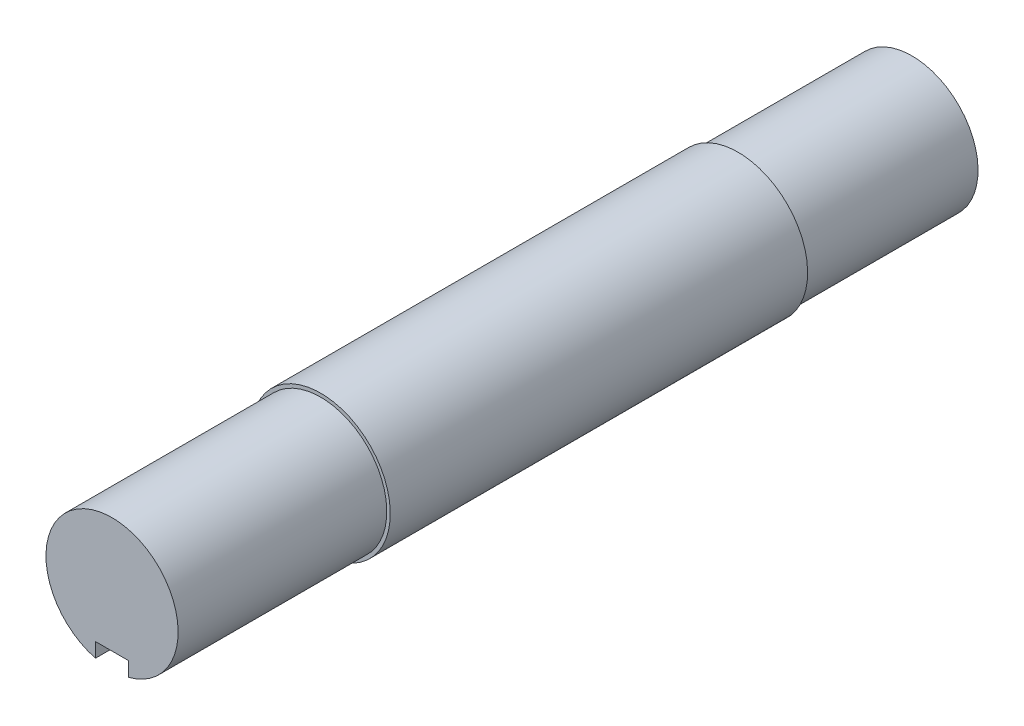
ISO-10303-21;
HEADER;
FILE_DESCRIPTION(('STEP AP214'),'2;1');
FILE_NAME('part.step','',(''),(''),'','','');
FILE_SCHEMA(('AUTOMOTIVE_DESIGN { 1 0 10303 214 1 1 1 1 }'));
ENDSEC;
DATA;
#1=APPLICATION_CONTEXT('core data for automotive mechanical design processes');
#2=APPLICATION_PROTOCOL_DEFINITION('international standard','automotive_design',2000,#1);
#3=PRODUCT_CONTEXT('',#1,'mechanical');
#4=PRODUCT('Part','Part','',(#3));
#5=PRODUCT_RELATED_PRODUCT_CATEGORY('part','',(#4));
#6=PRODUCT_DEFINITION_FORMATION('','',#4);
#7=PRODUCT_DEFINITION_CONTEXT('part definition',#1,'design');
#8=PRODUCT_DEFINITION('design','',#6,#7);
#9=PRODUCT_DEFINITION_SHAPE('','',#8);
#10=(LENGTH_UNIT() NAMED_UNIT(*) SI_UNIT(.MILLI.,.METRE.));
#11=(NAMED_UNIT(*) PLANE_ANGLE_UNIT() SI_UNIT($,.RADIAN.));
#12=(NAMED_UNIT(*) SI_UNIT($,.STERADIAN.) SOLID_ANGLE_UNIT());
#13=UNCERTAINTY_MEASURE_WITH_UNIT(LENGTH_MEASURE(1.E-05),#10,'distance_accuracy_value','');
#14=(GEOMETRIC_REPRESENTATION_CONTEXT(3) GLOBAL_UNCERTAINTY_ASSIGNED_CONTEXT((#13)) GLOBAL_UNIT_ASSIGNED_CONTEXT((#10,
#11,#12)) REPRESENTATION_CONTEXT('',''));
#15=CARTESIAN_POINT('',(0.,0.,0.));
#16=DIRECTION('',(0.,0.,1.));
#17=DIRECTION('',(1.,0.,0.));
#18=AXIS2_PLACEMENT_3D('',#15,#16,#17);
#19=CARTESIAN_POINT('',(-62.6618482291602,-361.310070053825,-562.673899999993));
#20=DIRECTION('',(0.,0.,-1.));
#21=DIRECTION('',(-1.,0.,0.));
#22=AXIS2_PLACEMENT_3D('',#19,#20,#21);
#23=CONICAL_SURFACE('',#22,3.39999999994989,1.02974425866087);
#24=CARTESIAN_POINT('',(-62.6618482291602,-361.310070053776,-560.630973895314));
#25=VERTEX_POINT('',#24);
#26=VERTEX_LOOP('',#25);
#27=FACE_BOUND('',#26,.T.);
#28=CARTESIAN_POINT('',(-62.6618482291602,-361.310070053825,-562.6739));
#29=DIRECTION('',(0.,0.,-1.));
#30=DIRECTION('',(-1.,0.,0.));
#31=AXIS2_PLACEMENT_3D('',#28,#29,#30);
#32=CIRCLE('',#31,3.4);
#33=CARTESIAN_POINT('',(-66.0618482291602,-361.310070053825,-562.6739));
#34=VERTEX_POINT('',#33);
#35=EDGE_CURVE('E174',#34,#34,#32,.T.);
#36=ORIENTED_EDGE('',*,*,#35,.T.);
#37=EDGE_LOOP('',(#36));
#38=FACE_BOUND('',#37,.T.);
#39=ADVANCED_FACE('F17',(#27,#38),#23,.F.);
#40=CARTESIAN_POINT('',(-62.6618482291602,-361.310070053825,-586.1739));
#41=DIRECTION('',(0.,0.,-1.));
#42=DIRECTION('',(-1.,0.,0.));
#43=AXIS2_PLACEMENT_3D('',#40,#41,#42);
#44=CYLINDRICAL_SURFACE('',#43,3.4);
#45=ORIENTED_EDGE('',*,*,#35,.F.);
#46=EDGE_LOOP('',(#45));
#47=FACE_BOUND('',#46,.T.);
#48=CARTESIAN_POINT('',(-62.6618482291602,-361.310070053825,-585.502730312044));
#49=DIRECTION('',(0.,0.,-1.));
#50=DIRECTION('',(1.,0.,0.));
#51=AXIS2_PLACEMENT_3D('',#48,#49,#50);
#52=CIRCLE('',#51,3.40000000001882);
#53=CARTESIAN_POINT('',(-59.2618482291414,-361.310070053825,-585.502730312044));
#54=VERTEX_POINT('',#53);
#55=EDGE_CURVE('E171',#54,#54,#52,.T.);
#56=ORIENTED_EDGE('',*,*,#55,.T.);
#57=EDGE_LOOP('',(#56));
#58=FACE_BOUND('',#57,.T.);
#59=ADVANCED_FACE('F252',(#47,#58),#44,.F.);
#60=CARTESIAN_POINT('',(-62.6618482291602,-361.310070053825,-586.173900000063));
#61=DIRECTION('',(0.,0.,-1.));
#62=DIRECTION('',(-1.,0.,0.));
#63=AXIS2_PLACEMENT_3D('',#60,#61,#62);
#64=CONICAL_SURFACE('',#63,4.56250000015333,1.04719755118561);
#65=CARTESIAN_POINT('',(-62.6618482291602,-361.310070053825,-586.173900000018));
#66=DIRECTION('',(0.,0.,-1.));
#67=DIRECTION('',(-1.,0.,0.));
#68=AXIS2_PLACEMENT_3D('',#65,#66,#67);
#69=CIRCLE('',#68,4.56250000007685);
#70=CARTESIAN_POINT('',(-67.2243482292371,-361.310070053825,-586.173900000018));
#71=VERTEX_POINT('',#70);
#72=EDGE_CURVE('E20',#71,#71,#69,.F.);
#73=ORIENTED_EDGE('',*,*,#72,.F.);
#74=EDGE_LOOP('',(#73));
#75=FACE_BOUND('',#74,.T.);
#76=ORIENTED_EDGE('',*,*,#55,.F.);
#77=EDGE_LOOP('',(#76));
#78=FACE_BOUND('',#77,.T.);
#79=ADVANCED_FACE('F249',(#75,#78),#64,.F.);
#80=CARTESIAN_POINT('',(-62.6618476114882,-361.310072168843,-586.1739));
#81=DIRECTION('',(0.,0.,-1.));
#82=DIRECTION('',(-1.,0.,0.));
#83=AXIS2_PLACEMENT_3D('',#80,#81,#82);
#84=PLANE('',#83);
#85=DIRECTION('',(1.,0.,0.));
#86=VECTOR('',#85,1.);
#87=CARTESIAN_POINT('',(-62.6618476114881,-368.428822168843,-586.1739));
#88=LINE('',#87,#86);
#89=CARTESIAN_POINT('',(-65.0430976114882,-368.428822168843,-586.1739));
#90=VERTEX_POINT('',#89);
#91=CARTESIAN_POINT('',(-60.2805976114881,-368.428822168843,-586.1739));
#92=VERTEX_POINT('',#91);
#93=EDGE_CURVE('E154',#90,#92,#88,.T.);
#94=ORIENTED_EDGE('',*,*,#93,.F.);
#95=DIRECTION('',(0.,-1.,0.));
#96=VECTOR('',#95,1.);
#97=CARTESIAN_POINT('',(-65.0430976114882,-368.428822168843,-586.1739));
#98=LINE('',#97,#96);
#99=CARTESIAN_POINT('',(-65.0430976114883,-370.506791607724,-586.1739));
#100=VERTEX_POINT('',#99);
#101=EDGE_CURVE('E148',#90,#100,#98,.T.);
#102=ORIENTED_EDGE('',*,*,#101,.T.);
#103=CARTESIAN_POINT('',(-62.6618476114882,-361.310072168843,-586.1739));
#104=DIRECTION('',(0.,0.,1.));
#105=DIRECTION('',(0.,-1.,0.));
#106=AXIS2_PLACEMENT_3D('',#103,#104,#105);
#107=CIRCLE('',#106,9.5);
#108=CARTESIAN_POINT('',(-60.280597611488,-370.506791607724,-586.1739));
#109=VERTEX_POINT('',#108);
#110=EDGE_CURVE('E387',#109,#100,#107,.T.);
#111=ORIENTED_EDGE('',*,*,#110,.F.);
#112=DIRECTION('',(0.,1.,0.));
#113=VECTOR('',#112,1.);
#114=CARTESIAN_POINT('',(-60.2805976114881,-368.428822168843,-586.1739));
#115=LINE('',#114,#113);
#116=EDGE_CURVE('E75',#109,#92,#115,.T.);
#117=ORIENTED_EDGE('',*,*,#116,.T.);
#118=EDGE_LOOP('',(#94,#102,#111,#117));
#119=FACE_BOUND('',#118,.T.);
#120=ORIENTED_EDGE('',*,*,#72,.T.);
#121=EDGE_LOOP('',(#120));
#122=FACE_BOUND('',#121,.T.);
#123=ADVANCED_FACE('F246',(#119,#122),#84,.T.);
#124=CARTESIAN_POINT('',(-60.2805976114881,-368.428822168843,-561.5739));
#125=DIRECTION('',(1.,0.,0.));
#126=DIRECTION('',(0.,1.,0.));
#127=AXIS2_PLACEMENT_3D('',#124,#125,#126);
#128=PLANE('',#127);
#129=DIRECTION('',(0.,0.,1.));
#130=VECTOR('',#129,1.);
#131=CARTESIAN_POINT('',(-60.280597611488,-370.506791607724,-506.1739));
#132=LINE('',#131,#130);
#133=CARTESIAN_POINT('',(-60.2805976114881,-370.506791607724,-561.1739));
#134=VERTEX_POINT('',#133);
#135=EDGE_CURVE('E142',#134,#109,#132,.F.);
#136=ORIENTED_EDGE('',*,*,#135,.F.);
#137=DIRECTION('',(0.,-1.,0.));
#138=VECTOR('',#137,1.);
#139=CARTESIAN_POINT('',(-60.2805976114881,-368.428822168843,-561.1739));
#140=LINE('',#139,#138);
#141=CARTESIAN_POINT('',(-60.2805976114881,-368.428822168843,-561.1739));
#142=VERTEX_POINT('',#141);
#143=EDGE_CURVE('E386',#134,#142,#140,.F.);
#144=ORIENTED_EDGE('',*,*,#143,.T.);
#145=DIRECTION('',(0.,0.,1.));
#146=VECTOR('',#145,1.);
#147=CARTESIAN_POINT('',(-60.2805976114881,-368.428822168843,-571.5739));
#148=LINE('',#147,#146);
#149=EDGE_CURVE('E149',#92,#142,#148,.T.);
#150=ORIENTED_EDGE('',*,*,#149,.F.);
#151=ORIENTED_EDGE('',*,*,#116,.F.);
#152=EDGE_LOOP('',(#136,#144,#150,#151));
#153=FACE_BOUND('',#152,.T.);
#154=ADVANCED_FACE('F242',(#153),#128,.F.);
#155=CARTESIAN_POINT('',(-62.6618476114881,-368.428822168843,-571.5739));
#156=DIRECTION('',(0.,-1.,0.));
#157=DIRECTION('',(1.,0.,0.));
#158=AXIS2_PLACEMENT_3D('',#155,#156,#157);
#159=PLANE('',#158);
#160=CARTESIAN_POINT('',(-62.6618476114881,-368.428822168843,-561.1739));
#161=DIRECTION('',(0.,-1.,0.));
#162=DIRECTION('',(1.,0.,0.));
#163=AXIS2_PLACEMENT_3D('',#160,#161,#162);
#164=CIRCLE('',#163,2.38125000000002);
#165=CARTESIAN_POINT('',(-65.0430976114882,-368.428822168843,-561.1739));
#166=VERTEX_POINT('',#165);
#167=EDGE_CURVE('E379',#142,#166,#164,.T.);
#168=ORIENTED_EDGE('',*,*,#167,.T.);
#169=DIRECTION('',(0.,0.,1.));
#170=VECTOR('',#169,1.);
#171=CARTESIAN_POINT('',(-65.0430976114882,-368.428822168843,-586.5739));
#172=LINE('',#171,#170);
#173=EDGE_CURVE('E145',#166,#90,#172,.F.);
#174=ORIENTED_EDGE('',*,*,#173,.T.);
#175=ORIENTED_EDGE('',*,*,#93,.T.);
#176=ORIENTED_EDGE('',*,*,#149,.T.);
#177=EDGE_LOOP('',(#168,#174,#175,#176));
#178=FACE_BOUND('',#177,.T.);
#179=ADVANCED_FACE('F238',(#178),#159,.T.);
#180=CARTESIAN_POINT('',(-65.0430976114882,-368.428822168843,-586.5739));
#181=DIRECTION('',(-1.,0.,0.));
#182=DIRECTION('',(0.,-1.,0.));
#183=AXIS2_PLACEMENT_3D('',#180,#181,#182);
#184=PLANE('',#183);
#185=ORIENTED_EDGE('',*,*,#101,.F.);
#186=ORIENTED_EDGE('',*,*,#173,.F.);
#187=DIRECTION('',(0.,-1.,0.));
#188=VECTOR('',#187,1.);
#189=CARTESIAN_POINT('',(-65.0430976114881,-368.428822168843,-561.1739));
#190=LINE('',#189,#188);
#191=CARTESIAN_POINT('',(-65.0430976114882,-370.506791607724,-561.1739));
#192=VERTEX_POINT('',#191);
#193=EDGE_CURVE('E108',#166,#192,#190,.T.);
#194=ORIENTED_EDGE('',*,*,#193,.T.);
#195=DIRECTION('',(0.,0.,1.));
#196=VECTOR('',#195,1.);
#197=CARTESIAN_POINT('',(-65.0430976114884,-370.506791607724,-506.1739));
#198=LINE('',#197,#196);
#199=EDGE_CURVE('E382',#100,#192,#198,.T.);
#200=ORIENTED_EDGE('',*,*,#199,.F.);
#201=EDGE_LOOP('',(#185,#186,#194,#200));
#202=FACE_BOUND('',#201,.T.);
#203=ADVANCED_FACE('F235',(#202),#184,.F.);
#204=CARTESIAN_POINT('',(-62.6618476114881,-368.428822168843,-571.5739));
#205=DIRECTION('',(0.,-1.,0.));
#206=DIRECTION('',(1.,0.,0.));
#207=AXIS2_PLACEMENT_3D('',#204,#205,#206);
#208=PLANE('',#207);
#209=DIRECTION('',(0.,0.,1.));
#210=VECTOR('',#209,1.);
#211=CARTESIAN_POINT('',(-60.2805976114881,-368.428822168843,-471.1739));
#212=LINE('',#211,#210);
#213=CARTESIAN_POINT('',(-60.2805976114881,-368.428822168843,-501.1739));
#214=VERTEX_POINT('',#213);
#215=CARTESIAN_POINT('',(-60.2805976114881,-368.428822168843,-471.1739));
#216=VERTEX_POINT('',#215);
#217=EDGE_CURVE('E164',#214,#216,#212,.T.);
#218=ORIENTED_EDGE('',*,*,#217,.T.);
#219=DIRECTION('',(1.,0.,0.));
#220=VECTOR('',#219,1.);
#221=CARTESIAN_POINT('',(-39.6618476114882,-368.428822168843,-471.1739));
#222=LINE('',#221,#220);
#223=CARTESIAN_POINT('',(-65.0430976114882,-368.428822168843,-471.1739));
#224=VERTEX_POINT('',#223);
#225=EDGE_CURVE('E84',#224,#216,#222,.T.);
#226=ORIENTED_EDGE('',*,*,#225,.F.);
#227=DIRECTION('',(0.,0.,1.));
#228=VECTOR('',#227,1.);
#229=CARTESIAN_POINT('',(-65.0430976114882,-368.428822168843,-501.1739));
#230=LINE('',#229,#228);
#231=CARTESIAN_POINT('',(-65.0430976114882,-368.428822168843,-501.1739));
#232=VERTEX_POINT('',#231);
#233=EDGE_CURVE('E140',#224,#232,#230,.F.);
#234=ORIENTED_EDGE('',*,*,#233,.T.);
#235=CARTESIAN_POINT('',(-62.6618476114881,-368.428822168843,-501.1739));
#236=DIRECTION('',(0.,-1.,0.));
#237=DIRECTION('',(1.,0.,0.));
#238=AXIS2_PLACEMENT_3D('',#235,#236,#237);
#239=CIRCLE('',#238,2.38125000000002);
#240=EDGE_CURVE('E132',#232,#214,#239,.T.);
#241=ORIENTED_EDGE('',*,*,#240,.T.);
#242=EDGE_LOOP('',(#218,#226,#234,#241));
#243=FACE_BOUND('',#242,.T.);
#244=ADVANCED_FACE('F231',(#243),#208,.T.);
#245=CARTESIAN_POINT('',(-39.6618476114882,-361.310072168843,-471.1739));
#246=DIRECTION('',(0.,0.,1.));
#247=DIRECTION('',(0.,-1.,0.));
#248=AXIS2_PLACEMENT_3D('',#245,#246,#247);
#249=PLANE('',#248);
#250=ORIENTED_EDGE('',*,*,#225,.T.);
#251=DIRECTION('',(0.,1.,0.));
#252=VECTOR('',#251,1.);
#253=CARTESIAN_POINT('',(-60.2805976114881,-368.428822168843,-471.1739));
#254=LINE('',#253,#252);
#255=CARTESIAN_POINT('',(-60.280597611488,-370.506791607724,-471.1739));
#256=VERTEX_POINT('',#255);
#257=EDGE_CURVE('E409',#216,#256,#254,.F.);
#258=ORIENTED_EDGE('',*,*,#257,.T.);
#259=CARTESIAN_POINT('',(-62.6618476114882,-361.310072168843,-471.1739));
#260=DIRECTION('',(0.,0.,1.));
#261=DIRECTION('',(0.,-1.,0.));
#262=AXIS2_PLACEMENT_3D('',#259,#260,#261);
#263=CIRCLE('',#262,9.5);
#264=CARTESIAN_POINT('',(-65.0430976114882,-370.506791607724,-471.1739));
#265=VERTEX_POINT('',#264);
#266=EDGE_CURVE('E393',#265,#256,#263,.F.);
#267=ORIENTED_EDGE('',*,*,#266,.F.);
#268=DIRECTION('',(0.,-1.,0.));
#269=VECTOR('',#268,1.);
#270=CARTESIAN_POINT('',(-65.0430976114882,-368.428822168843,-471.1739));
#271=LINE('',#270,#269);
#272=EDGE_CURVE('E127',#265,#224,#271,.F.);
#273=ORIENTED_EDGE('',*,*,#272,.T.);
#274=EDGE_LOOP('',(#250,#258,#267,#273));
#275=FACE_BOUND('',#274,.T.);
#276=ADVANCED_FACE('F227',(#275),#249,.T.);
#277=CARTESIAN_POINT('',(-60.2805976114881,-368.428822168843,-471.1739));
#278=DIRECTION('',(1.,0.,0.));
#279=DIRECTION('',(0.,1.,0.));
#280=AXIS2_PLACEMENT_3D('',#277,#278,#279);
#281=PLANE('',#280);
#282=ORIENTED_EDGE('',*,*,#257,.F.);
#283=ORIENTED_EDGE('',*,*,#217,.F.);
#284=DIRECTION('',(0.,-1.,0.));
#285=VECTOR('',#284,1.);
#286=CARTESIAN_POINT('',(-60.2805976114881,-368.428822168843,-501.1739));
#287=LINE('',#286,#285);
#288=CARTESIAN_POINT('',(-60.2805976114881,-370.506791607724,-501.1739));
#289=VERTEX_POINT('',#288);
#290=EDGE_CURVE('E134',#214,#289,#287,.T.);
#291=ORIENTED_EDGE('',*,*,#290,.T.);
#292=DIRECTION('',(0.,0.,1.));
#293=VECTOR('',#292,1.);
#294=CARTESIAN_POINT('',(-60.280597611488,-370.506791607724,-506.1739));
#295=LINE('',#294,#293);
#296=EDGE_CURVE('E117',#256,#289,#295,.F.);
#297=ORIENTED_EDGE('',*,*,#296,.F.);
#298=EDGE_LOOP('',(#282,#283,#291,#297));
#299=FACE_BOUND('',#298,.T.);
#300=ADVANCED_FACE('F224',(#299),#281,.F.);
#301=CARTESIAN_POINT('',(-65.0430976114882,-368.428822168843,-501.1739));
#302=DIRECTION('',(-1.,0.,0.));
#303=DIRECTION('',(0.,-1.,0.));
#304=AXIS2_PLACEMENT_3D('',#301,#302,#303);
#305=PLANE('',#304);
#306=DIRECTION('',(0.,-1.,0.));
#307=VECTOR('',#306,1.);
#308=CARTESIAN_POINT('',(-65.0430976114881,-368.428822168843,-501.1739));
#309=LINE('',#308,#307);
#310=CARTESIAN_POINT('',(-65.0430976114882,-370.506791607724,-501.1739));
#311=VERTEX_POINT('',#310);
#312=EDGE_CURVE('E107',#311,#232,#309,.F.);
#313=ORIENTED_EDGE('',*,*,#312,.T.);
#314=ORIENTED_EDGE('',*,*,#233,.F.);
#315=ORIENTED_EDGE('',*,*,#272,.F.);
#316=DIRECTION('',(0.,0.,1.));
#317=VECTOR('',#316,1.);
#318=CARTESIAN_POINT('',(-65.0430976114883,-370.506791607724,-506.1739));
#319=LINE('',#318,#317);
#320=EDGE_CURVE('E115',#311,#265,#319,.T.);
#321=ORIENTED_EDGE('',*,*,#320,.F.);
#322=EDGE_LOOP('',(#313,#314,#315,#321));
#323=FACE_BOUND('',#322,.T.);
#324=ADVANCED_FACE('F124',(#323),#305,.F.);
#325=CARTESIAN_POINT('',(-62.6618476114882,-361.310072168843,-506.1739));
#326=DIRECTION('',(0.,0.,1.));
#327=DIRECTION('',(0.,-1.,0.));
#328=AXIS2_PLACEMENT_3D('',#325,#326,#327);
#329=CYLINDRICAL_SURFACE('',#328,9.5);
#330=ORIENTED_EDGE('',*,*,#110,.T.);
#331=ORIENTED_EDGE('',*,*,#199,.T.);
#332=CARTESIAN_POINT('',(-62.6618476114882,-361.310072168843,-561.1739));
#333=DIRECTION('',(0.,0.,1.));
#334=DIRECTION('',(0.,-1.,0.));
#335=AXIS2_PLACEMENT_3D('',#332,#333,#334);
#336=CIRCLE('',#335,9.5);
#337=EDGE_CURVE('E395',#192,#134,#336,.F.);
#338=ORIENTED_EDGE('',*,*,#337,.T.);
#339=ORIENTED_EDGE('',*,*,#135,.T.);
#340=EDGE_LOOP('',(#330,#331,#338,#339));
#341=FACE_BOUND('',#340,.T.);
#342=ADVANCED_FACE('F212',(#341),#329,.T.);
#343=CARTESIAN_POINT('',(-62.6618476114881,-368.428822168843,-561.1739));
#344=DIRECTION('',(0.,-1.,0.));
#345=DIRECTION('',(1.,0.,0.));
#346=AXIS2_PLACEMENT_3D('',#343,#344,#345);
#347=CYLINDRICAL_SURFACE('',#346,2.38125000000002);
#348=DIRECTION('',(0.,1.,0.));
#349=VECTOR('',#348,1.);
#350=CARTESIAN_POINT('',(-65.0430976114882,-313.584646358099,-561.1739));
#351=LINE('',#350,#349);
#352=CARTESIAN_POINT('',(-65.0430976114882,-371.022417325266,-561.1739));
#353=VERTEX_POINT('',#352);
#354=EDGE_CURVE('E128',#353,#192,#351,.T.);
#355=ORIENTED_EDGE('',*,*,#354,.T.);
#356=ORIENTED_EDGE('',*,*,#193,.F.);
#357=ORIENTED_EDGE('',*,*,#167,.F.);
#358=ORIENTED_EDGE('',*,*,#143,.F.);
#359=DIRECTION('',(0.,1.,0.));
#360=VECTOR('',#359,1.);
#361=CARTESIAN_POINT('',(-60.2805976114881,-313.584646358099,-561.1739));
#362=LINE('',#361,#360);
#363=CARTESIAN_POINT('',(-60.2805976114881,-371.022417325266,-561.1739));
#364=VERTEX_POINT('',#363);
#365=EDGE_CURVE('E396',#134,#364,#362,.F.);
#366=ORIENTED_EDGE('',*,*,#365,.T.);
#367=CARTESIAN_POINT('',(-65.0430976114881,-371.022417325266,-561.1739));
#368=CARTESIAN_POINT('',(-65.0431051285064,-371.022410362358,-561.107941409772));
#369=CARTESIAN_POINT('',(-65.0403572232945,-371.023089078391,-561.041987200698));
#370=CARTESIAN_POINT('',(-65.0294089323898,-371.025766248685,-560.910569893393));
#371=CARTESIAN_POINT('',(-65.0212094008211,-371.027764496211,-560.845106719855));
#372=CARTESIAN_POINT('',(-64.9994364377248,-371.033024247968,-560.715253645668));
#373=CARTESIAN_POINT('',(-64.9858730214176,-371.036283397652,-560.65086197653));
#374=CARTESIAN_POINT('',(-64.9534967463199,-371.043962391445,-560.523500872626));
#375=CARTESIAN_POINT('',(-64.9346838286227,-371.048382248578,-560.460531453829));
#376=CARTESIAN_POINT('',(-64.8705721787484,-371.063199204113,-560.274420138017));
#377=CARTESIAN_POINT('',(-64.8175796971061,-371.075159046288,-560.153951905847));
#378=CARTESIAN_POINT('',(-64.6927127063096,-371.101886989693,-559.923647593426));
#379=CARTESIAN_POINT('',(-64.6208339288266,-371.116655725527,-559.813813924289));
#380=CARTESIAN_POINT('',(-64.4586971576835,-371.147665829063,-559.605657503008));
#381=CARTESIAN_POINT('',(-64.3681339912695,-371.163928777947,-559.507575222007));
#382=CARTESIAN_POINT('',(-64.1718541098008,-371.195908062872,-559.32783721758));
#383=CARTESIAN_POINT('',(-64.0661349996341,-371.211624312029,-559.246184095384));
#384=CARTESIAN_POINT('',(-63.8409000490248,-371.240977181641,-559.100645490896));
#385=CARTESIAN_POINT('',(-63.7212274756604,-371.254585175217,-559.036996271068));
#386=CARTESIAN_POINT('',(-63.4725110501521,-371.27794068905,-558.930810087629));
#387=CARTESIAN_POINT('',(-63.3434689283879,-371.287688919996,-558.888269237011));
#388=CARTESIAN_POINT('',(-63.0821964764727,-371.302074038735,-558.826273353473));
#389=CARTESIAN_POINT('',(-62.9500688301759,-371.30680187372,-558.806407043773));
#390=CARTESIAN_POINT('',(-62.6842742293506,-371.310929766538,-558.789035207414));
#391=CARTESIAN_POINT('',(-62.5506074492477,-371.310330422265,-558.791527171386));
#392=CARTESIAN_POINT('',(-62.2883807224972,-371.303939694367,-558.818502010667));
#393=CARTESIAN_POINT('',(-62.159772145626,-371.298253187644,-558.842540698192));
#394=CARTESIAN_POINT('',(-61.9084702585445,-371.282448211966,-558.911214845121));
#395=CARTESIAN_POINT('',(-61.785777195541,-371.272329557973,-558.95585116447));
#396=CARTESIAN_POINT('',(-61.5485913909498,-371.248633375178,-559.064826579555));
#397=CARTESIAN_POINT('',(-61.4341762043973,-371.235027500957,-559.129328056987));
#398=CARTESIAN_POINT('',(-61.2176385435404,-371.205839697879,-559.276079144411));
#399=CARTESIAN_POINT('',(-61.1155177166779,-371.190257504768,-559.358331128853));
#400=CARTESIAN_POINT('',(-60.9238286980569,-371.158370281051,-559.540632929925));
#401=CARTESIAN_POINT('',(-60.834629221504,-371.142056893855,-559.641069325714));
#402=CARTESIAN_POINT('',(-60.6742406233303,-371.110894358496,-559.855675854953));
#403=CARTESIAN_POINT('',(-60.6030564201907,-371.096045610879,-559.969849726444));
#404=CARTESIAN_POINT('',(-60.4805074077761,-371.069463547679,-560.209381052967));
#405=CARTESIAN_POINT('',(-60.4292350066223,-371.057744834818,-560.334787404222));
#406=CARTESIAN_POINT('',(-60.3486772938582,-371.038945847896,-560.592708394941));
#407=CARTESIAN_POINT('',(-60.3193591854169,-371.031858656973,-560.725212113268));
#408=CARTESIAN_POINT('',(-60.2945268080215,-371.025823580472,-560.911351327432));
#409=CARTESIAN_POINT('',(-60.2893021981835,-371.024548051546,-560.963761061791));
#410=CARTESIAN_POINT('',(-60.2823416541222,-371.022845392711,-561.068739001167));
#411=CARTESIAN_POINT('',(-60.2806000071173,-371.022416873544,-561.121306804817));
#412=CARTESIAN_POINT('',(-60.2805976114881,-371.022417325266,-561.1739));
#413=B_SPLINE_CURVE_WITH_KNOTS('',3,(#367,#368,#369,#370,#371,#372,#373,#374,#375,#376,#377,
#378,#379,#380,#381,#382,#383,#384,#385,#386,#387,#388,#389,#390,#391,#392,#393,#394,#395,#396,
#397,#398,#399,#400,#401,#402,#403,#404,#405,#406,#407,#408,#409,#410,#411,#412),.UNSPECIFIED.,
.F.,.F.,(4,2,2,2,2,2,2,2,2,2,2,2,2,2,2,2,2,2,2,2,2,2,4),(0.,0.197807483009359,0.395583982175202,
0.592992931794968,0.790404096707482,1.18485572270958,1.57939657211041,1.98098012389863,
2.38262720851842,2.78932343544483,3.19594474332415,3.59506720553972,3.9941448730213,
4.38518005737478,4.77623156878207,5.17056848879909,5.56495819121364,5.96900769207056,
6.37316738671361,6.77918093829311,7.1845867422623,7.34254454328701,7.50024304755259),.UNSPECIFIED.);
#414=EDGE_CURVE('E184',#353,#364,#413,.T.);
#415=ORIENTED_EDGE('',*,*,#414,.F.);
#416=EDGE_LOOP('',(#355,#356,#357,#358,#366,#415));
#417=FACE_BOUND('',#416,.T.);
#418=ADVANCED_FACE('F208',(#417),#347,.F.);
#419=CARTESIAN_POINT('',(-62.6618476114881,-368.428822168843,-501.1739));
#420=DIRECTION('',(0.,-1.,0.));
#421=DIRECTION('',(1.,0.,0.));
#422=AXIS2_PLACEMENT_3D('',#419,#420,#421);
#423=CYLINDRICAL_SURFACE('',#422,2.38125000000002);
#424=DIRECTION('',(0.,-1.,0.));
#425=VECTOR('',#424,1.);
#426=CARTESIAN_POINT('',(-60.2805976114881,-368.428822168843,-501.1739));
#427=LINE('',#426,#425);
#428=CARTESIAN_POINT('',(-60.2805976114881,-371.022417325266,-501.1739));
#429=VERTEX_POINT('',#428);
#430=EDGE_CURVE('E394',#289,#429,#427,.T.);
#431=ORIENTED_EDGE('',*,*,#430,.F.);
#432=ORIENTED_EDGE('',*,*,#290,.F.);
#433=ORIENTED_EDGE('',*,*,#240,.F.);
#434=ORIENTED_EDGE('',*,*,#312,.F.);
#435=DIRECTION('',(0.,-1.,0.));
#436=VECTOR('',#435,1.);
#437=CARTESIAN_POINT('',(-65.0430976114881,-368.428822168843,-501.1739));
#438=LINE('',#437,#436);
#439=CARTESIAN_POINT('',(-65.0430976114881,-371.022417325266,-501.1739));
#440=VERTEX_POINT('',#439);
#441=EDGE_CURVE('E98',#440,#311,#438,.F.);
#442=ORIENTED_EDGE('',*,*,#441,.F.);
#443=CARTESIAN_POINT('',(-60.2805976114881,-371.022417325266,-501.1739));
#444=CARTESIAN_POINT('',(-60.2805900944698,-371.022410362358,-501.239858590228));
#445=CARTESIAN_POINT('',(-60.2833379996817,-371.023089078391,-501.305812799302));
#446=CARTESIAN_POINT('',(-60.2942862905864,-371.025766248685,-501.437230106607));
#447=CARTESIAN_POINT('',(-60.302485822155,-371.027764496211,-501.502693280145));
#448=CARTESIAN_POINT('',(-60.3242587852514,-371.033024247968,-501.632546354332));
#449=CARTESIAN_POINT('',(-60.3378222015586,-371.036283397652,-501.69693802347));
#450=CARTESIAN_POINT('',(-60.3701984766563,-371.043962391444,-501.824299127374));
#451=CARTESIAN_POINT('',(-60.3890113943535,-371.048382248578,-501.887268546171));
#452=CARTESIAN_POINT('',(-60.4531230442278,-371.063199204113,-502.073379861983));
#453=CARTESIAN_POINT('',(-60.50611552587,-371.075159046288,-502.193848094153));
#454=CARTESIAN_POINT('',(-60.6309825166666,-371.101886989693,-502.424152406574));
#455=CARTESIAN_POINT('',(-60.7028612941496,-371.116655725527,-502.533986075711));
#456=CARTESIAN_POINT('',(-60.8649980652927,-371.147665829063,-502.742142496992));
#457=CARTESIAN_POINT('',(-60.9555612317067,-371.163928777947,-502.840224777993));
#458=CARTESIAN_POINT('',(-61.1518411131754,-371.195908062872,-503.01996278242));
#459=CARTESIAN_POINT('',(-61.2575602233421,-371.211624312029,-503.101615904616));
#460=CARTESIAN_POINT('',(-61.4827951739514,-371.240977181641,-503.247154509104));
#461=CARTESIAN_POINT('',(-61.6024677473158,-371.254585175217,-503.310803728932));
#462=CARTESIAN_POINT('',(-61.8511841728241,-371.27794068905,-503.416989912371));
#463=CARTESIAN_POINT('',(-61.9802262945883,-371.287688919996,-503.459530762989));
#464=CARTESIAN_POINT('',(-62.2414987465035,-371.302074038735,-503.521526646527));
#465=CARTESIAN_POINT('',(-62.3736263928003,-371.30680187372,-503.541392956227));
#466=CARTESIAN_POINT('',(-62.6394209936256,-371.310929766538,-503.558764792586));
#467=CARTESIAN_POINT('',(-62.7730877737285,-371.310330422265,-503.556272828614));
#468=CARTESIAN_POINT('',(-63.035314500479,-371.303939694367,-503.529297989333));
#469=CARTESIAN_POINT('',(-63.1639230773502,-371.298253187644,-503.505259301808));
#470=CARTESIAN_POINT('',(-63.4152249644317,-371.282448211966,-503.436585154879));
#471=CARTESIAN_POINT('',(-63.5379180274352,-371.272329557973,-503.39194883553));
#472=CARTESIAN_POINT('',(-63.7751038320264,-371.248633375178,-503.282973420445));
#473=CARTESIAN_POINT('',(-63.8895190185789,-371.235027500957,-503.218471943013));
#474=CARTESIAN_POINT('',(-64.1060566794358,-371.205839697879,-503.071720855589));
#475=CARTESIAN_POINT('',(-64.2081775062983,-371.190257504768,-502.989468871147));
#476=CARTESIAN_POINT('',(-64.3998665249193,-371.158370281051,-502.807167070075));
#477=CARTESIAN_POINT('',(-64.4890660014722,-371.142056893855,-502.706730674286));
#478=CARTESIAN_POINT('',(-64.6494545996458,-371.110894358496,-502.492124145048));
#479=CARTESIAN_POINT('',(-64.7206388027855,-371.096045610879,-502.377950273556));
#480=CARTESIAN_POINT('',(-64.8431878152001,-371.069463547679,-502.138418947033));
#481=CARTESIAN_POINT('',(-64.8944602163538,-371.057744834818,-502.013012595778));
#482=CARTESIAN_POINT('',(-64.975017929118,-371.038945847896,-501.755091605059));
#483=CARTESIAN_POINT('',(-65.0043360375593,-371.031858656973,-501.622587886732));
#484=CARTESIAN_POINT('',(-65.0291684149547,-371.025823580472,-501.436448672568));
#485=CARTESIAN_POINT('',(-65.0343930247928,-371.024548051546,-501.384038938209));
#486=CARTESIAN_POINT('',(-65.041353568854,-371.022845392711,-501.279060998833));
#487=CARTESIAN_POINT('',(-65.0430952158589,-371.022416873544,-501.226493195183));
#488=CARTESIAN_POINT('',(-65.0430976114881,-371.022417325266,-501.1739));
#489=B_SPLINE_CURVE_WITH_KNOTS('',3,(#443,#444,#445,#446,#447,#448,#449,#450,#451,#452,#453,
#454,#455,#456,#457,#458,#459,#460,#461,#462,#463,#464,#465,#466,#467,#468,#469,#470,#471,#472,
#473,#474,#475,#476,#477,#478,#479,#480,#481,#482,#483,#484,#485,#486,#487,#488),.UNSPECIFIED.,
.F.,.F.,(4,2,2,2,2,2,2,2,2,2,2,2,2,2,2,2,2,2,2,2,2,2,4),(0.,0.197807483009248,0.395583982175089,
0.592992931794736,0.790404096707482,1.18485572270945,1.57939657211041,1.98098012389862,
2.38262720851843,2.78932343544483,3.19594474332417,3.59506720553976,3.99414487302131,
4.38518005737477,4.77623156878207,5.17056848879911,5.56495819121365,5.96900769207045,
6.37316738671362,6.779180938293,7.18458674226231,7.34254454328735,7.5002430475526),.UNSPECIFIED.);
#490=EDGE_CURVE('E119',#429,#440,#489,.T.);
#491=ORIENTED_EDGE('',*,*,#490,.F.);
#492=EDGE_LOOP('',(#431,#432,#433,#434,#442,#491));
#493=FACE_BOUND('',#492,.T.);
#494=ADVANCED_FACE('F130',(#493),#423,.F.);
#495=CARTESIAN_POINT('',(-62.6618476114882,-361.310072168843,-506.1739));
#496=DIRECTION('',(0.,0.,1.));
#497=DIRECTION('',(0.,-1.,0.));
#498=AXIS2_PLACEMENT_3D('',#495,#496,#497);
#499=CYLINDRICAL_SURFACE('',#498,9.5);
#500=CARTESIAN_POINT('',(-62.6618476114882,-361.310072168843,-501.1739));
#501=DIRECTION('',(0.,0.,1.));
#502=DIRECTION('',(0.,-1.,0.));
#503=AXIS2_PLACEMENT_3D('',#500,#501,#502);
#504=CIRCLE('',#503,9.5);
#505=EDGE_CURVE('E101',#289,#311,#504,.T.);
#506=ORIENTED_EDGE('',*,*,#505,.T.);
#507=ORIENTED_EDGE('',*,*,#320,.T.);
#508=ORIENTED_EDGE('',*,*,#266,.T.);
#509=ORIENTED_EDGE('',*,*,#296,.T.);
#510=EDGE_LOOP('',(#506,#507,#508,#509));
#511=FACE_BOUND('',#510,.T.);
#512=ADVANCED_FACE('F113',(#511),#499,.T.);
#513=CARTESIAN_POINT('',(-62.6618476114885,-313.584646358099,-561.1739));
#514=DIRECTION('',(0.,0.,1.));
#515=DIRECTION('',(1.,0.,0.));
#516=AXIS2_PLACEMENT_3D('',#513,#514,#515);
#517=PLANE('',#516);
#518=CARTESIAN_POINT('',(-62.6618476114882,-361.310072168843,-561.1739));
#519=DIRECTION('',(0.,0.,1.));
#520=DIRECTION('',(0.,-1.,0.));
#521=AXIS2_PLACEMENT_3D('',#518,#519,#520);
#522=CIRCLE('',#521,10.);
#523=EDGE_CURVE('E26',#364,#353,#522,.T.);
#524=ORIENTED_EDGE('',*,*,#523,.F.);
#525=ORIENTED_EDGE('',*,*,#365,.F.);
#526=ORIENTED_EDGE('',*,*,#337,.F.);
#527=ORIENTED_EDGE('',*,*,#354,.F.);
#528=EDGE_LOOP('',(#524,#525,#526,#527));
#529=FACE_BOUND('',#528,.T.);
#530=ADVANCED_FACE('F200',(#529),#517,.F.);
#531=CARTESIAN_POINT('',(-62.6618476114883,-361.310072168843,-501.1739));
#532=DIRECTION('',(0.,0.,-1.));
#533=DIRECTION('',(0.,1.,0.));
#534=AXIS2_PLACEMENT_3D('',#531,#532,#533);
#535=PLANE('',#534);
#536=ORIENTED_EDGE('',*,*,#441,.T.);
#537=ORIENTED_EDGE('',*,*,#505,.F.);
#538=ORIENTED_EDGE('',*,*,#430,.T.);
#539=CARTESIAN_POINT('',(-62.6618476114882,-361.310072168843,-501.1739));
#540=DIRECTION('',(0.,0.,1.));
#541=DIRECTION('',(0.,-1.,0.));
#542=AXIS2_PLACEMENT_3D('',#539,#540,#541);
#543=CIRCLE('',#542,10.);
#544=EDGE_CURVE('E11',#440,#429,#543,.F.);
#545=ORIENTED_EDGE('',*,*,#544,.F.);
#546=EDGE_LOOP('',(#536,#537,#538,#545));
#547=FACE_BOUND('',#546,.T.);
#548=ADVANCED_FACE('F100',(#547),#535,.F.);
#549=CARTESIAN_POINT('',(-62.6618476114882,-361.310072168843,-506.1739));
#550=DIRECTION('',(0.,0.,1.));
#551=DIRECTION('',(0.,-1.,0.));
#552=AXIS2_PLACEMENT_3D('',#549,#550,#551);
#553=CYLINDRICAL_SURFACE('',#552,10.);
#554=ORIENTED_EDGE('',*,*,#414,.T.);
#555=ORIENTED_EDGE('',*,*,#523,.T.);
#556=EDGE_LOOP('',(#554,#555));
#557=FACE_BOUND('',#556,.T.);
#558=ORIENTED_EDGE('',*,*,#544,.T.);
#559=ORIENTED_EDGE('',*,*,#490,.T.);
#560=EDGE_LOOP('',(#558,#559));
#561=FACE_BOUND('',#560,.T.);
#562=ADVANCED_FACE('F192',(#557,#561),#553,.T.);
#563=CLOSED_SHELL('',(#39,#59,#79,#123,#154,#179,#203,#244,#276,#300,#324,#342,#418,#494,#512,
#530,#548,#562));
#564=MANIFOLD_SOLID_BREP('B1',#563);
#565=ADVANCED_BREP_SHAPE_REPRESENTATION('',(#18,#564),#14);
#566=SHAPE_DEFINITION_REPRESENTATION(#9,#565);
ENDSEC;
END-ISO-10303-21;
